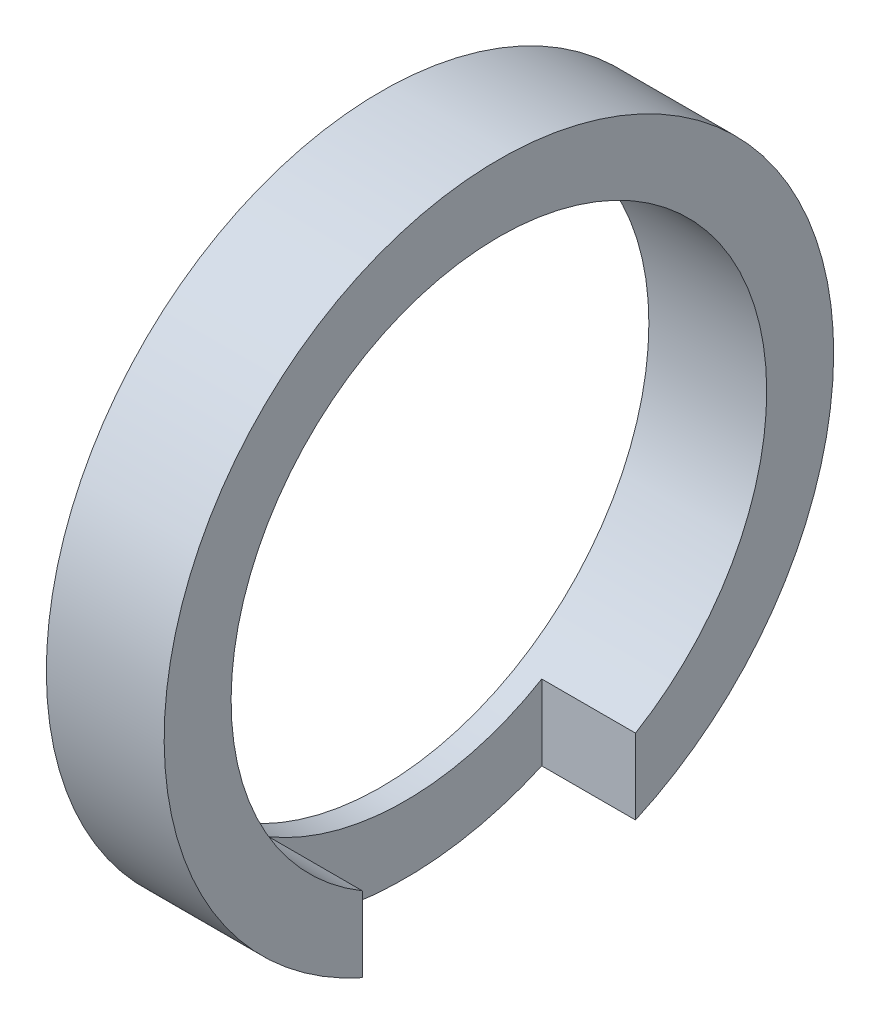
ISO-10303-21;
HEADER;
FILE_DESCRIPTION(('STEP AP214'),'2;1');
FILE_NAME('part.step','',(''),(''),'','','');
FILE_SCHEMA(('AUTOMOTIVE_DESIGN { 1 0 10303 214 1 1 1 1 }'));
ENDSEC;
DATA;
#1=APPLICATION_CONTEXT('core data for automotive mechanical design processes');
#2=APPLICATION_PROTOCOL_DEFINITION('international standard','automotive_design',2000,#1);
#3=PRODUCT_CONTEXT('',#1,'mechanical');
#4=PRODUCT('Part','Part','',(#3));
#5=PRODUCT_RELATED_PRODUCT_CATEGORY('part','',(#4));
#6=PRODUCT_DEFINITION_FORMATION('','',#4);
#7=PRODUCT_DEFINITION_CONTEXT('part definition',#1,'design');
#8=PRODUCT_DEFINITION('design','',#6,#7);
#9=PRODUCT_DEFINITION_SHAPE('','',#8);
#10=(LENGTH_UNIT() NAMED_UNIT(*) SI_UNIT(.MILLI.,.METRE.));
#11=(NAMED_UNIT(*) PLANE_ANGLE_UNIT() SI_UNIT($,.RADIAN.));
#12=(NAMED_UNIT(*) SI_UNIT($,.STERADIAN.) SOLID_ANGLE_UNIT());
#13=UNCERTAINTY_MEASURE_WITH_UNIT(LENGTH_MEASURE(1.E-05),#10,'distance_accuracy_value','');
#14=(GEOMETRIC_REPRESENTATION_CONTEXT(3) GLOBAL_UNCERTAINTY_ASSIGNED_CONTEXT((#13)) GLOBAL_UNIT_ASSIGNED_CONTEXT((#10,
#11,#12)) REPRESENTATION_CONTEXT('',''));
#15=CARTESIAN_POINT('',(0.,0.,0.));
#16=DIRECTION('',(0.,0.,1.));
#17=DIRECTION('',(1.,0.,0.));
#18=AXIS2_PLACEMENT_3D('',#15,#16,#17);
#19=CARTESIAN_POINT('',(5.588,0.,0.));
#20=DIRECTION('',(1.,0.,0.));
#21=DIRECTION('',(0.,0.,-1.));
#22=AXIS2_PLACEMENT_3D('',#19,#20,#21);
#23=PLANE('',#22);
#24=DIRECTION('',(0.,-1.,0.));
#25=VECTOR('',#24,1.);
#26=CARTESIAN_POINT('',(5.588,-10.9242148916982,6.477));
#27=LINE('',#26,#25);
#28=CARTESIAN_POINT('',(5.588,-10.9242148916982,6.477));
#29=VERTEX_POINT('',#28);
#30=CARTESIAN_POINT('',(5.588,-14.4935880995701,6.477));
#31=VERTEX_POINT('',#30);
#32=EDGE_CURVE('E74',#29,#31,#27,.T.);
#33=ORIENTED_EDGE('',*,*,#32,.F.);
#34=CARTESIAN_POINT('',(5.588,0.,0.));
#35=DIRECTION('',(1.,0.,0.));
#36=DIRECTION('',(0.,0.,-1.));
#37=AXIS2_PLACEMENT_3D('',#34,#35,#36);
#38=CIRCLE('',#37,12.7);
#39=CARTESIAN_POINT('',(5.588,-10.9242148916982,-6.477));
#40=VERTEX_POINT('',#39);
#41=EDGE_CURVE('E99',#40,#29,#38,.T.);
#42=ORIENTED_EDGE('',*,*,#41,.F.);
#43=DIRECTION('',(0.,1.,0.));
#44=VECTOR('',#43,1.);
#45=CARTESIAN_POINT('',(5.588,-10.9242148916982,-6.477));
#46=LINE('',#45,#44);
#47=CARTESIAN_POINT('',(5.588,-14.4935880995701,-6.477));
#48=VERTEX_POINT('',#47);
#49=EDGE_CURVE('E132',#48,#40,#46,.T.);
#50=ORIENTED_EDGE('',*,*,#49,.F.);
#51=CARTESIAN_POINT('',(5.588,0.,0.));
#52=DIRECTION('',(1.,0.,0.));
#53=DIRECTION('',(0.,0.,-1.));
#54=AXIS2_PLACEMENT_3D('',#51,#52,#53);
#55=CIRCLE('',#54,15.875);
#56=EDGE_CURVE('E43',#48,#31,#55,.T.);
#57=ORIENTED_EDGE('',*,*,#56,.T.);
#58=EDGE_LOOP('',(#33,#42,#50,#57));
#59=FACE_BOUND('',#58,.T.);
#60=ADVANCED_FACE('F35',(#59),#23,.T.);
#61=CARTESIAN_POINT('',(0.,0.,0.));
#62=DIRECTION('',(1.,0.,0.));
#63=DIRECTION('',(0.,0.,-1.));
#64=AXIS2_PLACEMENT_3D('',#61,#62,#63);
#65=PLANE('',#64);
#66=CARTESIAN_POINT('',(0.,0.,0.));
#67=DIRECTION('',(1.,0.,0.));
#68=DIRECTION('',(0.,0.,-1.));
#69=AXIS2_PLACEMENT_3D('',#66,#67,#68);
#70=CIRCLE('',#69,15.875);
#71=CARTESIAN_POINT('',(0.,0.,-15.875));
#72=VERTEX_POINT('',#71);
#73=EDGE_CURVE('E102',#72,#72,#70,.T.);
#74=ORIENTED_EDGE('',*,*,#73,.F.);
#75=EDGE_LOOP('',(#74));
#76=FACE_BOUND('',#75,.T.);
#77=CARTESIAN_POINT('',(0.,0.,0.));
#78=DIRECTION('',(1.,0.,0.));
#79=DIRECTION('',(0.,0.,-1.));
#80=AXIS2_PLACEMENT_3D('',#77,#78,#79);
#81=CIRCLE('',#80,12.7);
#82=CARTESIAN_POINT('',(0.,0.,-12.7));
#83=VERTEX_POINT('',#82);
#84=EDGE_CURVE('E103',#83,#83,#81,.T.);
#85=ORIENTED_EDGE('',*,*,#84,.T.);
#86=EDGE_LOOP('',(#85));
#87=FACE_BOUND('',#86,.T.);
#88=ADVANCED_FACE('F109',(#76,#87),#65,.F.);
#89=CARTESIAN_POINT('',(5.588,0.,0.));
#90=DIRECTION('',(-1.,0.,0.));
#91=DIRECTION('',(0.,0.,1.));
#92=AXIS2_PLACEMENT_3D('',#89,#90,#91);
#93=CYLINDRICAL_SURFACE('',#92,15.875);
#94=CARTESIAN_POINT('',(1.143,0.,0.));
#95=DIRECTION('',(1.,0.,0.));
#96=DIRECTION('',(0.,0.,1.));
#97=AXIS2_PLACEMENT_3D('',#94,#95,#96);
#98=CIRCLE('',#97,15.875);
#99=CARTESIAN_POINT('',(1.143,-14.4935880995701,6.477));
#100=VERTEX_POINT('',#99);
#101=CARTESIAN_POINT('',(1.143,-14.4935880995701,-6.477));
#102=VERTEX_POINT('',#101);
#103=EDGE_CURVE('E84',#100,#102,#98,.T.);
#104=ORIENTED_EDGE('',*,*,#103,.F.);
#105=DIRECTION('',(1.,0.,0.));
#106=VECTOR('',#105,1.);
#107=CARTESIAN_POINT('',(1.143,-14.4935880995701,6.477));
#108=LINE('',#107,#106);
#109=EDGE_CURVE('E58',#100,#31,#108,.T.);
#110=ORIENTED_EDGE('',*,*,#109,.T.);
#111=ORIENTED_EDGE('',*,*,#56,.F.);
#112=DIRECTION('',(1.,0.,0.));
#113=VECTOR('',#112,1.);
#114=CARTESIAN_POINT('',(1.143,-14.4935880995701,-6.477));
#115=LINE('',#114,#113);
#116=EDGE_CURVE('E78',#102,#48,#115,.T.);
#117=ORIENTED_EDGE('',*,*,#116,.F.);
#118=EDGE_LOOP('',(#104,#110,#111,#117));
#119=FACE_BOUND('',#118,.T.);
#120=ORIENTED_EDGE('',*,*,#73,.T.);
#121=EDGE_LOOP('',(#120));
#122=FACE_BOUND('',#121,.T.);
#123=ADVANCED_FACE('F37',(#119,#122),#93,.T.);
#124=CARTESIAN_POINT('',(5.588,0.,0.));
#125=DIRECTION('',(-1.,0.,0.));
#126=DIRECTION('',(0.,0.,1.));
#127=AXIS2_PLACEMENT_3D('',#124,#125,#126);
#128=CYLINDRICAL_SURFACE('',#127,12.7);
#129=DIRECTION('',(1.,0.,0.));
#130=VECTOR('',#129,1.);
#131=CARTESIAN_POINT('',(1.143,-10.9242148916982,6.477));
#132=LINE('',#131,#130);
#133=CARTESIAN_POINT('',(1.143,-10.9242148916982,6.477));
#134=VERTEX_POINT('',#133);
#135=EDGE_CURVE('E94',#134,#29,#132,.T.);
#136=ORIENTED_EDGE('',*,*,#135,.F.);
#137=CARTESIAN_POINT('',(1.143,0.,0.));
#138=DIRECTION('',(-1.,0.,0.));
#139=DIRECTION('',(0.,0.,1.));
#140=AXIS2_PLACEMENT_3D('',#137,#138,#139);
#141=CIRCLE('',#140,12.7);
#142=CARTESIAN_POINT('',(1.143,-10.9242148916982,-6.477));
#143=VERTEX_POINT('',#142);
#144=EDGE_CURVE('E11',#143,#134,#141,.T.);
#145=ORIENTED_EDGE('',*,*,#144,.F.);
#146=DIRECTION('',(1.,0.,0.));
#147=VECTOR('',#146,1.);
#148=CARTESIAN_POINT('',(1.143,-10.9242148916982,-6.477));
#149=LINE('',#148,#147);
#150=EDGE_CURVE('E81',#143,#40,#149,.T.);
#151=ORIENTED_EDGE('',*,*,#150,.T.);
#152=ORIENTED_EDGE('',*,*,#41,.T.);
#153=EDGE_LOOP('',(#136,#145,#151,#152));
#154=FACE_BOUND('',#153,.T.);
#155=ORIENTED_EDGE('',*,*,#84,.F.);
#156=EDGE_LOOP('',(#155));
#157=FACE_BOUND('',#156,.T.);
#158=ADVANCED_FACE('F114',(#154,#157),#128,.F.);
#159=CARTESIAN_POINT('',(1.143,-10.9242148916982,6.477));
#160=DIRECTION('',(0.,0.,1.));
#161=DIRECTION('',(1.,0.,0.));
#162=AXIS2_PLACEMENT_3D('',#159,#160,#161);
#163=PLANE('',#162);
#164=ORIENTED_EDGE('',*,*,#32,.T.);
#165=ORIENTED_EDGE('',*,*,#109,.F.);
#166=DIRECTION('',(0.,-1.,0.));
#167=VECTOR('',#166,1.);
#168=CARTESIAN_POINT('',(1.143,-10.9242148916982,6.477));
#169=LINE('',#168,#167);
#170=EDGE_CURVE('E83',#134,#100,#169,.T.);
#171=ORIENTED_EDGE('',*,*,#170,.F.);
#172=ORIENTED_EDGE('',*,*,#135,.T.);
#173=EDGE_LOOP('',(#164,#165,#171,#172));
#174=FACE_BOUND('',#173,.T.);
#175=ADVANCED_FACE('F116',(#174),#163,.F.);
#176=CARTESIAN_POINT('',(1.143,-10.9242148916982,-6.477));
#177=DIRECTION('',(0.,0.,-1.));
#178=DIRECTION('',(-1.,0.,0.));
#179=AXIS2_PLACEMENT_3D('',#176,#177,#178);
#180=PLANE('',#179);
#181=ORIENTED_EDGE('',*,*,#49,.T.);
#182=ORIENTED_EDGE('',*,*,#150,.F.);
#183=DIRECTION('',(0.,1.,0.));
#184=VECTOR('',#183,1.);
#185=CARTESIAN_POINT('',(1.143,-10.9242148916982,-6.477));
#186=LINE('',#185,#184);
#187=EDGE_CURVE('E49',#102,#143,#186,.T.);
#188=ORIENTED_EDGE('',*,*,#187,.F.);
#189=ORIENTED_EDGE('',*,*,#116,.T.);
#190=EDGE_LOOP('',(#181,#182,#188,#189));
#191=FACE_BOUND('',#190,.T.);
#192=ADVANCED_FACE('F76',(#191),#180,.F.);
#193=CARTESIAN_POINT('',(1.143,0.,0.));
#194=DIRECTION('',(-1.,0.,0.));
#195=DIRECTION('',(0.,0.,1.));
#196=AXIS2_PLACEMENT_3D('',#193,#194,#195);
#197=PLANE('',#196);
#198=ORIENTED_EDGE('',*,*,#144,.T.);
#199=ORIENTED_EDGE('',*,*,#170,.T.);
#200=ORIENTED_EDGE('',*,*,#103,.T.);
#201=ORIENTED_EDGE('',*,*,#187,.T.);
#202=EDGE_LOOP('',(#198,#199,#200,#201));
#203=FACE_BOUND('',#202,.T.);
#204=ADVANCED_FACE('F87',(#203),#197,.F.);
#205=CLOSED_SHELL('',(#60,#88,#123,#158,#175,#192,#204));
#206=MANIFOLD_SOLID_BREP('B2',#205);
#207=ADVANCED_BREP_SHAPE_REPRESENTATION('',(#18,#206),#14);
#208=SHAPE_DEFINITION_REPRESENTATION(#9,#207);
ENDSEC;
END-ISO-10303-21;
